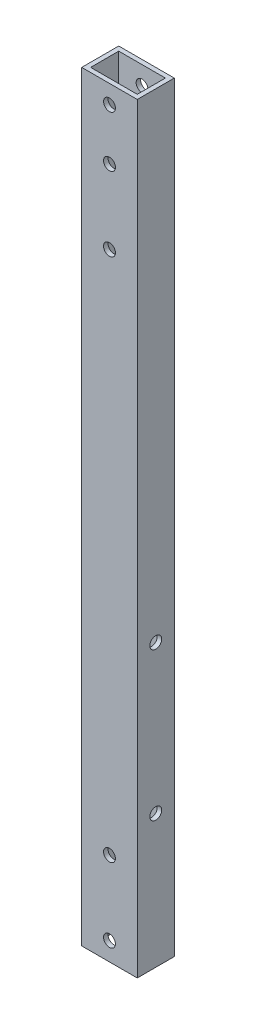
ISO-10303-21;
HEADER;
FILE_DESCRIPTION(('STEP AP214'),'2;1');
FILE_NAME('part.step','',(''),(''),'','','');
FILE_SCHEMA(('AUTOMOTIVE_DESIGN { 1 0 10303 214 1 1 1 1 }'));
ENDSEC;
DATA;
#1=APPLICATION_CONTEXT('core data for automotive mechanical design processes');
#2=APPLICATION_PROTOCOL_DEFINITION('international standard','automotive_design',2000,#1);
#3=PRODUCT_CONTEXT('',#1,'mechanical');
#4=PRODUCT('Part','Part','',(#3));
#5=PRODUCT_RELATED_PRODUCT_CATEGORY('part','',(#4));
#6=PRODUCT_DEFINITION_FORMATION('','',#4);
#7=PRODUCT_DEFINITION_CONTEXT('part definition',#1,'design');
#8=PRODUCT_DEFINITION('design','',#6,#7);
#9=PRODUCT_DEFINITION_SHAPE('','',#8);
#10=(LENGTH_UNIT() NAMED_UNIT(*) SI_UNIT(.MILLI.,.METRE.));
#11=(NAMED_UNIT(*) PLANE_ANGLE_UNIT() SI_UNIT($,.RADIAN.));
#12=(NAMED_UNIT(*) SI_UNIT($,.STERADIAN.) SOLID_ANGLE_UNIT());
#13=UNCERTAINTY_MEASURE_WITH_UNIT(LENGTH_MEASURE(1.E-05),#10,'distance_accuracy_value','');
#14=(GEOMETRIC_REPRESENTATION_CONTEXT(3) GLOBAL_UNCERTAINTY_ASSIGNED_CONTEXT((#13)) GLOBAL_UNIT_ASSIGNED_CONTEXT((#10,
#11,#12)) REPRESENTATION_CONTEXT('',''));
#15=CARTESIAN_POINT('',(0.,0.,0.));
#16=DIRECTION('',(0.,0.,1.));
#17=DIRECTION('',(1.,0.,0.));
#18=AXIS2_PLACEMENT_3D('',#15,#16,#17);
#19=CARTESIAN_POINT('',(7.5,110.,-5.));
#20=DIRECTION('',(-1.,0.,0.));
#21=DIRECTION('',(0.,0.,1.));
#22=AXIS2_PLACEMENT_3D('',#19,#20,#21);
#23=PLANE('',#22);
#24=CARTESIAN_POINT('',(7.5,-74.,0.));
#25=DIRECTION('',(1.,0.,0.));
#26=DIRECTION('',(0.,0.,-1.));
#27=AXIS2_PLACEMENT_3D('',#24,#25,#26);
#28=CIRCLE('',#27,1.60000000000001);
#29=CARTESIAN_POINT('',(7.5,-74.,-1.60000000000001));
#30=VERTEX_POINT('',#29);
#31=EDGE_CURVE('E188',#30,#30,#28,.T.);
#32=ORIENTED_EDGE('',*,*,#31,.F.);
#33=EDGE_LOOP('',(#32));
#34=FACE_BOUND('',#33,.T.);
#35=CARTESIAN_POINT('',(7.5,-34.,0.));
#36=DIRECTION('',(1.,0.,0.));
#37=DIRECTION('',(0.,0.,-1.));
#38=AXIS2_PLACEMENT_3D('',#35,#36,#37);
#39=CIRCLE('',#38,1.6);
#40=CARTESIAN_POINT('',(7.5,-34.,-1.6));
#41=VERTEX_POINT('',#40);
#42=EDGE_CURVE('E191',#41,#41,#39,.T.);
#43=ORIENTED_EDGE('',*,*,#42,.F.);
#44=EDGE_LOOP('',(#43));
#45=FACE_BOUND('',#44,.T.);
#46=DIRECTION('',(0.,0.,-1.));
#47=VECTOR('',#46,1.);
#48=CARTESIAN_POINT('',(7.5,95.5,5.));
#49=LINE('',#48,#47);
#50=CARTESIAN_POINT('',(7.5,95.5,5.));
#51=VERTEX_POINT('',#50);
#52=CARTESIAN_POINT('',(7.5,95.5,-5.));
#53=VERTEX_POINT('',#52);
#54=EDGE_CURVE('E104',#51,#53,#49,.T.);
#55=ORIENTED_EDGE('',*,*,#54,.F.);
#56=DIRECTION('',(0.,-1.,0.));
#57=VECTOR('',#56,1.);
#58=CARTESIAN_POINT('',(7.5,110.,5.));
#59=LINE('',#58,#57);
#60=CARTESIAN_POINT('',(7.5,-110.,5.));
#61=VERTEX_POINT('',#60);
#62=EDGE_CURVE('E114',#51,#61,#59,.T.);
#63=ORIENTED_EDGE('',*,*,#62,.T.);
#64=DIRECTION('',(0.,0.,-1.));
#65=VECTOR('',#64,1.);
#66=CARTESIAN_POINT('',(7.5,-110.,-5.));
#67=LINE('',#66,#65);
#68=CARTESIAN_POINT('',(7.5,-110.,-5.));
#69=VERTEX_POINT('',#68);
#70=EDGE_CURVE('E237',#61,#69,#67,.T.);
#71=ORIENTED_EDGE('',*,*,#70,.T.);
#72=DIRECTION('',(0.,-1.,0.));
#73=VECTOR('',#72,1.);
#74=CARTESIAN_POINT('',(7.5,110.,-5.));
#75=LINE('',#74,#73);
#76=EDGE_CURVE('E47',#53,#69,#75,.T.);
#77=ORIENTED_EDGE('',*,*,#76,.F.);
#78=EDGE_LOOP('',(#55,#63,#71,#77));
#79=FACE_BOUND('',#78,.T.);
#80=ADVANCED_FACE('F39',(#34,#45,#79),#23,.F.);
#81=CARTESIAN_POINT('',(-7.5,110.,-5.));
#82=DIRECTION('',(0.,0.,1.));
#83=DIRECTION('',(1.,0.,0.));
#84=AXIS2_PLACEMENT_3D('',#81,#82,#83);
#85=PLANE('',#84);
#86=CARTESIAN_POINT('',(0.,90.5,-5.));
#87=DIRECTION('',(0.,0.,-1.));
#88=DIRECTION('',(-1.,0.,0.));
#89=AXIS2_PLACEMENT_3D('',#86,#87,#88);
#90=CIRCLE('',#89,1.6);
#91=CARTESIAN_POINT('',(-1.6,90.5,-5.));
#92=VERTEX_POINT('',#91);
#93=EDGE_CURVE('E154',#92,#92,#90,.T.);
#94=ORIENTED_EDGE('',*,*,#93,.F.);
#95=EDGE_LOOP('',(#94));
#96=FACE_BOUND('',#95,.T.);
#97=CARTESIAN_POINT('',(0.,76.66,-5.));
#98=DIRECTION('',(0.,0.,-1.));
#99=DIRECTION('',(-1.,0.,0.));
#100=AXIS2_PLACEMENT_3D('',#97,#98,#99);
#101=CIRCLE('',#100,1.6);
#102=CARTESIAN_POINT('',(-1.6,76.66,-5.));
#103=VERTEX_POINT('',#102);
#104=EDGE_CURVE('E495',#103,#103,#101,.T.);
#105=ORIENTED_EDGE('',*,*,#104,.F.);
#106=EDGE_LOOP('',(#105));
#107=FACE_BOUND('',#106,.T.);
#108=CARTESIAN_POINT('',(0.,56.66,-5.));
#109=DIRECTION('',(0.,0.,-1.));
#110=DIRECTION('',(-1.,0.,0.));
#111=AXIS2_PLACEMENT_3D('',#108,#109,#110);
#112=CIRCLE('',#111,1.6);
#113=CARTESIAN_POINT('',(-1.6,56.66,-5.));
#114=VERTEX_POINT('',#113);
#115=EDGE_CURVE('E498',#114,#114,#112,.T.);
#116=ORIENTED_EDGE('',*,*,#115,.F.);
#117=EDGE_LOOP('',(#116));
#118=FACE_BOUND('',#117,.T.);
#119=CARTESIAN_POINT('',(0.,-105.,-5.));
#120=DIRECTION('',(0.,0.,-1.));
#121=DIRECTION('',(-1.,0.,0.));
#122=AXIS2_PLACEMENT_3D('',#119,#120,#121);
#123=CIRCLE('',#122,1.60000000000001);
#124=CARTESIAN_POINT('',(-1.60000000000001,-105.,-5.));
#125=VERTEX_POINT('',#124);
#126=EDGE_CURVE('E203',#125,#125,#123,.T.);
#127=ORIENTED_EDGE('',*,*,#126,.F.);
#128=EDGE_LOOP('',(#127));
#129=FACE_BOUND('',#128,.T.);
#130=CARTESIAN_POINT('',(0.,-85.,-5.));
#131=DIRECTION('',(0.,0.,-1.));
#132=DIRECTION('',(-1.,0.,0.));
#133=AXIS2_PLACEMENT_3D('',#130,#131,#132);
#134=CIRCLE('',#133,1.6);
#135=CARTESIAN_POINT('',(-1.6,-85.,-5.));
#136=VERTEX_POINT('',#135);
#137=EDGE_CURVE('E136',#136,#136,#134,.T.);
#138=ORIENTED_EDGE('',*,*,#137,.F.);
#139=EDGE_LOOP('',(#138));
#140=FACE_BOUND('',#139,.T.);
#141=DIRECTION('',(-1.,0.,0.));
#142=VECTOR('',#141,1.);
#143=CARTESIAN_POINT('',(7.5,95.5,-5.));
#144=LINE('',#143,#142);
#145=CARTESIAN_POINT('',(-7.5,95.5,-5.));
#146=VERTEX_POINT('',#145);
#147=EDGE_CURVE('E116',#53,#146,#144,.T.);
#148=ORIENTED_EDGE('',*,*,#147,.F.);
#149=ORIENTED_EDGE('',*,*,#76,.T.);
#150=DIRECTION('',(-1.,0.,0.));
#151=VECTOR('',#150,1.);
#152=CARTESIAN_POINT('',(-7.5,-110.,-5.));
#153=LINE('',#152,#151);
#154=CARTESIAN_POINT('',(-7.5,-110.,-5.));
#155=VERTEX_POINT('',#154);
#156=EDGE_CURVE('E239',#69,#155,#153,.T.);
#157=ORIENTED_EDGE('',*,*,#156,.T.);
#158=DIRECTION('',(0.,-1.,0.));
#159=VECTOR('',#158,1.);
#160=CARTESIAN_POINT('',(-7.5,110.,-5.));
#161=LINE('',#160,#159);
#162=EDGE_CURVE('E124',#146,#155,#161,.T.);
#163=ORIENTED_EDGE('',*,*,#162,.F.);
#164=EDGE_LOOP('',(#148,#149,#157,#163));
#165=FACE_BOUND('',#164,.T.);
#166=ADVANCED_FACE('F251',(#96,#107,#118,#129,#140,#165),#85,.F.);
#167=CARTESIAN_POINT('',(-7.5,110.,-5.));
#168=DIRECTION('',(1.,0.,0.));
#169=DIRECTION('',(0.,0.,-1.));
#170=AXIS2_PLACEMENT_3D('',#167,#168,#169);
#171=PLANE('',#170);
#172=CARTESIAN_POINT('',(-7.5,-74.,0.));
#173=DIRECTION('',(1.,0.,0.));
#174=DIRECTION('',(0.,0.,-1.));
#175=AXIS2_PLACEMENT_3D('',#172,#173,#174);
#176=CIRCLE('',#175,1.60000000000001);
#177=CARTESIAN_POINT('',(-7.5,-74.,-1.60000000000001));
#178=VERTEX_POINT('',#177);
#179=EDGE_CURVE('E194',#178,#178,#176,.T.);
#180=ORIENTED_EDGE('',*,*,#179,.T.);
#181=EDGE_LOOP('',(#180));
#182=FACE_BOUND('',#181,.T.);
#183=CARTESIAN_POINT('',(-7.5,-34.,0.));
#184=DIRECTION('',(1.,0.,0.));
#185=DIRECTION('',(0.,0.,-1.));
#186=AXIS2_PLACEMENT_3D('',#183,#184,#185);
#187=CIRCLE('',#186,1.6);
#188=CARTESIAN_POINT('',(-7.5,-34.,-1.6));
#189=VERTEX_POINT('',#188);
#190=EDGE_CURVE('E146',#189,#189,#187,.T.);
#191=ORIENTED_EDGE('',*,*,#190,.T.);
#192=EDGE_LOOP('',(#191));
#193=FACE_BOUND('',#192,.T.);
#194=DIRECTION('',(0.,0.,1.));
#195=VECTOR('',#194,1.);
#196=CARTESIAN_POINT('',(-7.5,95.5,-5.));
#197=LINE('',#196,#195);
#198=CARTESIAN_POINT('',(-7.5,95.5,5.));
#199=VERTEX_POINT('',#198);
#200=EDGE_CURVE('E55',#146,#199,#197,.T.);
#201=ORIENTED_EDGE('',*,*,#200,.F.);
#202=ORIENTED_EDGE('',*,*,#162,.T.);
#203=DIRECTION('',(0.,0.,1.));
#204=VECTOR('',#203,1.);
#205=CARTESIAN_POINT('',(-7.5,-110.,-5.));
#206=LINE('',#205,#204);
#207=CARTESIAN_POINT('',(-7.5,-110.,5.));
#208=VERTEX_POINT('',#207);
#209=EDGE_CURVE('E126',#155,#208,#206,.T.);
#210=ORIENTED_EDGE('',*,*,#209,.T.);
#211=DIRECTION('',(0.,-1.,0.));
#212=VECTOR('',#211,1.);
#213=CARTESIAN_POINT('',(-7.5,110.,5.));
#214=LINE('',#213,#212);
#215=EDGE_CURVE('E122',#199,#208,#214,.T.);
#216=ORIENTED_EDGE('',*,*,#215,.F.);
#217=EDGE_LOOP('',(#201,#202,#210,#216));
#218=FACE_BOUND('',#217,.T.);
#219=ADVANCED_FACE('F244',(#182,#193,#218),#171,.F.);
#220=CARTESIAN_POINT('',(-7.5,110.,5.));
#221=DIRECTION('',(0.,0.,-1.));
#222=DIRECTION('',(-1.,0.,0.));
#223=AXIS2_PLACEMENT_3D('',#220,#221,#222);
#224=PLANE('',#223);
#225=CARTESIAN_POINT('',(0.,90.5,5.));
#226=DIRECTION('',(0.,0.,-1.));
#227=DIRECTION('',(-1.,0.,0.));
#228=AXIS2_PLACEMENT_3D('',#225,#226,#227);
#229=CIRCLE('',#228,1.6);
#230=CARTESIAN_POINT('',(-1.6,90.5,5.));
#231=VERTEX_POINT('',#230);
#232=EDGE_CURVE('E109',#231,#231,#229,.T.);
#233=ORIENTED_EDGE('',*,*,#232,.T.);
#234=EDGE_LOOP('',(#233));
#235=FACE_BOUND('',#234,.T.);
#236=CARTESIAN_POINT('',(0.,76.66,5.));
#237=DIRECTION('',(0.,0.,-1.));
#238=DIRECTION('',(-1.,0.,0.));
#239=AXIS2_PLACEMENT_3D('',#236,#237,#238);
#240=CIRCLE('',#239,1.6);
#241=CARTESIAN_POINT('',(-1.6,76.66,5.));
#242=VERTEX_POINT('',#241);
#243=EDGE_CURVE('E162',#242,#242,#240,.T.);
#244=ORIENTED_EDGE('',*,*,#243,.T.);
#245=EDGE_LOOP('',(#244));
#246=FACE_BOUND('',#245,.T.);
#247=CARTESIAN_POINT('',(0.,56.66,5.));
#248=DIRECTION('',(0.,0.,-1.));
#249=DIRECTION('',(-1.,0.,0.));
#250=AXIS2_PLACEMENT_3D('',#247,#248,#249);
#251=CIRCLE('',#250,1.6);
#252=CARTESIAN_POINT('',(-1.6,56.66,5.));
#253=VERTEX_POINT('',#252);
#254=EDGE_CURVE('E158',#253,#253,#251,.T.);
#255=ORIENTED_EDGE('',*,*,#254,.T.);
#256=EDGE_LOOP('',(#255));
#257=FACE_BOUND('',#256,.T.);
#258=CARTESIAN_POINT('',(0.,-105.,5.));
#259=DIRECTION('',(0.,0.,-1.));
#260=DIRECTION('',(-1.,0.,0.));
#261=AXIS2_PLACEMENT_3D('',#258,#259,#260);
#262=CIRCLE('',#261,1.60000000000001);
#263=CARTESIAN_POINT('',(-1.60000000000001,-105.,5.));
#264=VERTEX_POINT('',#263);
#265=EDGE_CURVE('E141',#264,#264,#262,.T.);
#266=ORIENTED_EDGE('',*,*,#265,.T.);
#267=EDGE_LOOP('',(#266));
#268=FACE_BOUND('',#267,.T.);
#269=CARTESIAN_POINT('',(0.,-85.,5.));
#270=DIRECTION('',(0.,0.,-1.));
#271=DIRECTION('',(-1.,0.,0.));
#272=AXIS2_PLACEMENT_3D('',#269,#270,#271);
#273=CIRCLE('',#272,1.6);
#274=CARTESIAN_POINT('',(-1.6,-85.,5.));
#275=VERTEX_POINT('',#274);
#276=EDGE_CURVE('E214',#275,#275,#273,.T.);
#277=ORIENTED_EDGE('',*,*,#276,.T.);
#278=EDGE_LOOP('',(#277));
#279=FACE_BOUND('',#278,.T.);
#280=DIRECTION('',(1.,0.,0.));
#281=VECTOR('',#280,1.);
#282=CARTESIAN_POINT('',(-7.5,95.5,5.));
#283=LINE('',#282,#281);
#284=EDGE_CURVE('E101',#199,#51,#283,.T.);
#285=ORIENTED_EDGE('',*,*,#284,.F.);
#286=ORIENTED_EDGE('',*,*,#215,.T.);
#287=DIRECTION('',(1.,0.,0.));
#288=VECTOR('',#287,1.);
#289=CARTESIAN_POINT('',(-7.5,-110.,5.));
#290=LINE('',#289,#288);
#291=EDGE_CURVE('E120',#208,#61,#290,.T.);
#292=ORIENTED_EDGE('',*,*,#291,.T.);
#293=ORIENTED_EDGE('',*,*,#62,.F.);
#294=EDGE_LOOP('',(#285,#286,#292,#293));
#295=FACE_BOUND('',#294,.T.);
#296=ADVANCED_FACE('F118',(#235,#246,#257,#268,#279,#295),#224,.F.);
#297=CARTESIAN_POINT('',(-6.3,110.,-3.8));
#298=DIRECTION('',(1.,0.,0.));
#299=DIRECTION('',(0.,0.,-1.));
#300=AXIS2_PLACEMENT_3D('',#297,#298,#299);
#301=PLANE('',#300);
#302=CARTESIAN_POINT('',(-6.3,-34.,0.));
#303=DIRECTION('',(1.,0.,0.));
#304=DIRECTION('',(0.,0.,-1.));
#305=AXIS2_PLACEMENT_3D('',#302,#303,#304);
#306=CIRCLE('',#305,1.6);
#307=CARTESIAN_POINT('',(-6.3,-34.,-1.6));
#308=VERTEX_POINT('',#307);
#309=EDGE_CURVE('E149',#308,#308,#306,.T.);
#310=ORIENTED_EDGE('',*,*,#309,.F.);
#311=EDGE_LOOP('',(#310));
#312=FACE_BOUND('',#311,.T.);
#313=CARTESIAN_POINT('',(-6.3,-74.,0.));
#314=DIRECTION('',(1.,0.,0.));
#315=DIRECTION('',(0.,0.,-1.));
#316=AXIS2_PLACEMENT_3D('',#313,#314,#315);
#317=CIRCLE('',#316,1.60000000000001);
#318=CARTESIAN_POINT('',(-6.3,-74.,-1.60000000000001));
#319=VERTEX_POINT('',#318);
#320=EDGE_CURVE('E145',#319,#319,#317,.T.);
#321=ORIENTED_EDGE('',*,*,#320,.F.);
#322=EDGE_LOOP('',(#321));
#323=FACE_BOUND('',#322,.T.);
#324=DIRECTION('',(0.,-1.,0.));
#325=VECTOR('',#324,1.);
#326=CARTESIAN_POINT('',(-6.3,110.,-3.8));
#327=LINE('',#326,#325);
#328=CARTESIAN_POINT('',(-6.3,95.5,-3.8));
#329=VERTEX_POINT('',#328);
#330=CARTESIAN_POINT('',(-6.3,-110.,-3.8));
#331=VERTEX_POINT('',#330);
#332=EDGE_CURVE('E229',#329,#331,#327,.T.);
#333=ORIENTED_EDGE('',*,*,#332,.F.);
#334=DIRECTION('',(0.,0.,1.));
#335=VECTOR('',#334,1.);
#336=CARTESIAN_POINT('',(-6.3,95.5,-3.8));
#337=LINE('',#336,#335);
#338=CARTESIAN_POINT('',(-6.3,95.5,3.8));
#339=VERTEX_POINT('',#338);
#340=EDGE_CURVE('E63',#329,#339,#337,.T.);
#341=ORIENTED_EDGE('',*,*,#340,.T.);
#342=DIRECTION('',(0.,-1.,0.));
#343=VECTOR('',#342,1.);
#344=CARTESIAN_POINT('',(-6.3,110.,3.8));
#345=LINE('',#344,#343);
#346=CARTESIAN_POINT('',(-6.3,-110.,3.8));
#347=VERTEX_POINT('',#346);
#348=EDGE_CURVE('E235',#339,#347,#345,.T.);
#349=ORIENTED_EDGE('',*,*,#348,.T.);
#350=DIRECTION('',(0.,0.,1.));
#351=VECTOR('',#350,1.);
#352=CARTESIAN_POINT('',(-6.3,-110.,-3.8));
#353=LINE('',#352,#351);
#354=EDGE_CURVE('E217',#331,#347,#353,.T.);
#355=ORIENTED_EDGE('',*,*,#354,.F.);
#356=EDGE_LOOP('',(#333,#341,#349,#355));
#357=FACE_BOUND('',#356,.T.);
#358=ADVANCED_FACE('F267',(#312,#323,#357),#301,.T.);
#359=CARTESIAN_POINT('',(-6.3,110.,3.8));
#360=DIRECTION('',(0.,0.,-1.));
#361=DIRECTION('',(-1.,0.,0.));
#362=AXIS2_PLACEMENT_3D('',#359,#360,#361);
#363=PLANE('',#362);
#364=CARTESIAN_POINT('',(0.,90.5,3.8));
#365=DIRECTION('',(0.,0.,-1.));
#366=DIRECTION('',(-1.,0.,0.));
#367=AXIS2_PLACEMENT_3D('',#364,#365,#366);
#368=CIRCLE('',#367,1.6);
#369=CARTESIAN_POINT('',(-1.6,90.5,3.8));
#370=VERTEX_POINT('',#369);
#371=EDGE_CURVE('E174',#370,#370,#368,.T.);
#372=ORIENTED_EDGE('',*,*,#371,.F.);
#373=EDGE_LOOP('',(#372));
#374=FACE_BOUND('',#373,.T.);
#375=CARTESIAN_POINT('',(0.,76.66,3.8));
#376=DIRECTION('',(0.,0.,-1.));
#377=DIRECTION('',(-1.,0.,0.));
#378=AXIS2_PLACEMENT_3D('',#375,#376,#377);
#379=CIRCLE('',#378,1.6);
#380=CARTESIAN_POINT('',(-1.6,76.66,3.8));
#381=VERTEX_POINT('',#380);
#382=EDGE_CURVE('E157',#381,#381,#379,.T.);
#383=ORIENTED_EDGE('',*,*,#382,.F.);
#384=EDGE_LOOP('',(#383));
#385=FACE_BOUND('',#384,.T.);
#386=CARTESIAN_POINT('',(0.,56.66,3.8));
#387=DIRECTION('',(0.,0.,-1.));
#388=DIRECTION('',(-1.,0.,0.));
#389=AXIS2_PLACEMENT_3D('',#386,#387,#388);
#390=CIRCLE('',#389,1.6);
#391=CARTESIAN_POINT('',(-1.6,56.66,3.8));
#392=VERTEX_POINT('',#391);
#393=EDGE_CURVE('E153',#392,#392,#390,.T.);
#394=ORIENTED_EDGE('',*,*,#393,.F.);
#395=EDGE_LOOP('',(#394));
#396=FACE_BOUND('',#395,.T.);
#397=CARTESIAN_POINT('',(0.,-85.,3.8));
#398=DIRECTION('',(0.,0.,-1.));
#399=DIRECTION('',(-1.,0.,0.));
#400=AXIS2_PLACEMENT_3D('',#397,#398,#399);
#401=CIRCLE('',#400,1.6);
#402=CARTESIAN_POINT('',(-1.6,-85.,3.8));
#403=VERTEX_POINT('',#402);
#404=EDGE_CURVE('E140',#403,#403,#401,.T.);
#405=ORIENTED_EDGE('',*,*,#404,.F.);
#406=EDGE_LOOP('',(#405));
#407=FACE_BOUND('',#406,.T.);
#408=CARTESIAN_POINT('',(0.,-105.,3.8));
#409=DIRECTION('',(0.,0.,-1.));
#410=DIRECTION('',(-1.,0.,0.));
#411=AXIS2_PLACEMENT_3D('',#408,#409,#410);
#412=CIRCLE('',#411,1.60000000000001);
#413=CARTESIAN_POINT('',(-1.60000000000001,-105.,3.8));
#414=VERTEX_POINT('',#413);
#415=EDGE_CURVE('E135',#414,#414,#412,.T.);
#416=ORIENTED_EDGE('',*,*,#415,.F.);
#417=EDGE_LOOP('',(#416));
#418=FACE_BOUND('',#417,.T.);
#419=ORIENTED_EDGE('',*,*,#348,.F.);
#420=DIRECTION('',(1.,0.,0.));
#421=VECTOR('',#420,1.);
#422=CARTESIAN_POINT('',(-6.3,95.5,3.8));
#423=LINE('',#422,#421);
#424=CARTESIAN_POINT('',(6.3,95.5,3.8));
#425=VERTEX_POINT('',#424);
#426=EDGE_CURVE('E184',#339,#425,#423,.T.);
#427=ORIENTED_EDGE('',*,*,#426,.T.);
#428=DIRECTION('',(0.,-1.,0.));
#429=VECTOR('',#428,1.);
#430=CARTESIAN_POINT('',(6.3,110.,3.8));
#431=LINE('',#430,#429);
#432=CARTESIAN_POINT('',(6.3,-110.,3.8));
#433=VERTEX_POINT('',#432);
#434=EDGE_CURVE('E233',#425,#433,#431,.T.);
#435=ORIENTED_EDGE('',*,*,#434,.T.);
#436=DIRECTION('',(1.,0.,0.));
#437=VECTOR('',#436,1.);
#438=CARTESIAN_POINT('',(-6.3,-110.,3.8));
#439=LINE('',#438,#437);
#440=EDGE_CURVE('E220',#347,#433,#439,.T.);
#441=ORIENTED_EDGE('',*,*,#440,.F.);
#442=EDGE_LOOP('',(#419,#427,#435,#441));
#443=FACE_BOUND('',#442,.T.);
#444=ADVANCED_FACE('F275',(#374,#385,#396,#407,#418,#443),#363,.T.);
#445=CARTESIAN_POINT('',(6.3,110.,-3.8));
#446=DIRECTION('',(-1.,0.,0.));
#447=DIRECTION('',(0.,0.,1.));
#448=AXIS2_PLACEMENT_3D('',#445,#446,#447);
#449=PLANE('',#448);
#450=CARTESIAN_POINT('',(6.3,-34.,0.));
#451=DIRECTION('',(-1.,0.,0.));
#452=DIRECTION('',(0.,0.,1.));
#453=AXIS2_PLACEMENT_3D('',#450,#451,#452);
#454=CIRCLE('',#453,1.6);
#455=CARTESIAN_POINT('',(6.3,-34.,1.6));
#456=VERTEX_POINT('',#455);
#457=EDGE_CURVE('E147',#456,#456,#454,.T.);
#458=ORIENTED_EDGE('',*,*,#457,.F.);
#459=EDGE_LOOP('',(#458));
#460=FACE_BOUND('',#459,.T.);
#461=CARTESIAN_POINT('',(6.3,-74.,0.));
#462=DIRECTION('',(-1.,0.,0.));
#463=DIRECTION('',(0.,0.,1.));
#464=AXIS2_PLACEMENT_3D('',#461,#462,#463);
#465=CIRCLE('',#464,1.60000000000001);
#466=CARTESIAN_POINT('',(6.3,-74.,1.60000000000001));
#467=VERTEX_POINT('',#466);
#468=EDGE_CURVE('E142',#467,#467,#465,.T.);
#469=ORIENTED_EDGE('',*,*,#468,.F.);
#470=EDGE_LOOP('',(#469));
#471=FACE_BOUND('',#470,.T.);
#472=ORIENTED_EDGE('',*,*,#434,.F.);
#473=DIRECTION('',(0.,0.,-1.));
#474=VECTOR('',#473,1.);
#475=CARTESIAN_POINT('',(6.3,95.5,-3.8));
#476=LINE('',#475,#474);
#477=CARTESIAN_POINT('',(6.3,95.5,-3.8));
#478=VERTEX_POINT('',#477);
#479=EDGE_CURVE('E181',#425,#478,#476,.T.);
#480=ORIENTED_EDGE('',*,*,#479,.T.);
#481=DIRECTION('',(0.,-1.,0.));
#482=VECTOR('',#481,1.);
#483=CARTESIAN_POINT('',(6.3,110.,-3.8));
#484=LINE('',#483,#482);
#485=CARTESIAN_POINT('',(6.3,-110.,-3.8));
#486=VERTEX_POINT('',#485);
#487=EDGE_CURVE('E231',#478,#486,#484,.T.);
#488=ORIENTED_EDGE('',*,*,#487,.T.);
#489=DIRECTION('',(0.,0.,-1.));
#490=VECTOR('',#489,1.);
#491=CARTESIAN_POINT('',(6.3,-110.,-3.8));
#492=LINE('',#491,#490);
#493=EDGE_CURVE('E223',#433,#486,#492,.T.);
#494=ORIENTED_EDGE('',*,*,#493,.F.);
#495=EDGE_LOOP('',(#472,#480,#488,#494));
#496=FACE_BOUND('',#495,.T.);
#497=ADVANCED_FACE('F279',(#460,#471,#496),#449,.T.);
#498=CARTESIAN_POINT('',(-6.3,110.,-3.8));
#499=DIRECTION('',(0.,0.,1.));
#500=DIRECTION('',(1.,0.,0.));
#501=AXIS2_PLACEMENT_3D('',#498,#499,#500);
#502=PLANE('',#501);
#503=CARTESIAN_POINT('',(0.,90.5,-3.8));
#504=DIRECTION('',(0.,0.,1.));
#505=DIRECTION('',(1.,0.,0.));
#506=AXIS2_PLACEMENT_3D('',#503,#504,#505);
#507=CIRCLE('',#506,1.6);
#508=CARTESIAN_POINT('',(1.6,90.5,-3.8));
#509=VERTEX_POINT('',#508);
#510=EDGE_CURVE('E42',#509,#509,#507,.T.);
#511=ORIENTED_EDGE('',*,*,#510,.F.);
#512=EDGE_LOOP('',(#511));
#513=FACE_BOUND('',#512,.T.);
#514=CARTESIAN_POINT('',(0.,76.66,-3.8));
#515=DIRECTION('',(0.,0.,1.));
#516=DIRECTION('',(1.,0.,0.));
#517=AXIS2_PLACEMENT_3D('',#514,#515,#516);
#518=CIRCLE('',#517,1.6);
#519=CARTESIAN_POINT('',(1.6,76.66,-3.8));
#520=VERTEX_POINT('',#519);
#521=EDGE_CURVE('E155',#520,#520,#518,.T.);
#522=ORIENTED_EDGE('',*,*,#521,.F.);
#523=EDGE_LOOP('',(#522));
#524=FACE_BOUND('',#523,.T.);
#525=CARTESIAN_POINT('',(0.,56.66,-3.8));
#526=DIRECTION('',(0.,0.,1.));
#527=DIRECTION('',(1.,0.,0.));
#528=AXIS2_PLACEMENT_3D('',#525,#526,#527);
#529=CIRCLE('',#528,1.6);
#530=CARTESIAN_POINT('',(1.6,56.66,-3.8));
#531=VERTEX_POINT('',#530);
#532=EDGE_CURVE('E151',#531,#531,#529,.T.);
#533=ORIENTED_EDGE('',*,*,#532,.F.);
#534=EDGE_LOOP('',(#533));
#535=FACE_BOUND('',#534,.T.);
#536=CARTESIAN_POINT('',(0.,-85.,-3.8));
#537=DIRECTION('',(0.,0.,1.));
#538=DIRECTION('',(1.,0.,0.));
#539=AXIS2_PLACEMENT_3D('',#536,#537,#538);
#540=CIRCLE('',#539,1.6);
#541=CARTESIAN_POINT('',(1.6,-85.,-3.8));
#542=VERTEX_POINT('',#541);
#543=EDGE_CURVE('E137',#542,#542,#540,.T.);
#544=ORIENTED_EDGE('',*,*,#543,.F.);
#545=EDGE_LOOP('',(#544));
#546=FACE_BOUND('',#545,.T.);
#547=CARTESIAN_POINT('',(0.,-105.,-3.8));
#548=DIRECTION('',(0.,0.,1.));
#549=DIRECTION('',(1.,0.,0.));
#550=AXIS2_PLACEMENT_3D('',#547,#548,#549);
#551=CIRCLE('',#550,1.60000000000001);
#552=CARTESIAN_POINT('',(1.60000000000001,-105.,-3.8));
#553=VERTEX_POINT('',#552);
#554=EDGE_CURVE('E132',#553,#553,#551,.T.);
#555=ORIENTED_EDGE('',*,*,#554,.F.);
#556=EDGE_LOOP('',(#555));
#557=FACE_BOUND('',#556,.T.);
#558=ORIENTED_EDGE('',*,*,#487,.F.);
#559=DIRECTION('',(-1.,0.,0.));
#560=VECTOR('',#559,1.);
#561=CARTESIAN_POINT('',(-6.3,95.5,-3.8));
#562=LINE('',#561,#560);
#563=EDGE_CURVE('E11',#478,#329,#562,.T.);
#564=ORIENTED_EDGE('',*,*,#563,.T.);
#565=ORIENTED_EDGE('',*,*,#332,.T.);
#566=DIRECTION('',(-1.,0.,0.));
#567=VECTOR('',#566,1.);
#568=CARTESIAN_POINT('',(-6.3,-110.,-3.8));
#569=LINE('',#568,#567);
#570=EDGE_CURVE('E226',#486,#331,#569,.T.);
#571=ORIENTED_EDGE('',*,*,#570,.F.);
#572=EDGE_LOOP('',(#558,#564,#565,#571));
#573=FACE_BOUND('',#572,.T.);
#574=ADVANCED_FACE('F272',(#513,#524,#535,#546,#557,#573),#502,.T.);
#575=CARTESIAN_POINT('',(0.,-110.,0.));
#576=DIRECTION('',(0.,1.,0.));
#577=DIRECTION('',(0.,0.,1.));
#578=AXIS2_PLACEMENT_3D('',#575,#576,#577);
#579=PLANE('',#578);
#580=ORIENTED_EDGE('',*,*,#70,.F.);
#581=ORIENTED_EDGE('',*,*,#291,.F.);
#582=ORIENTED_EDGE('',*,*,#209,.F.);
#583=ORIENTED_EDGE('',*,*,#156,.F.);
#584=EDGE_LOOP('',(#580,#581,#582,#583));
#585=FACE_BOUND('',#584,.T.);
#586=ORIENTED_EDGE('',*,*,#354,.T.);
#587=ORIENTED_EDGE('',*,*,#440,.T.);
#588=ORIENTED_EDGE('',*,*,#493,.T.);
#589=ORIENTED_EDGE('',*,*,#570,.T.);
#590=EDGE_LOOP('',(#586,#587,#588,#589));
#591=FACE_BOUND('',#590,.T.);
#592=ADVANCED_FACE('F248',(#585,#591),#579,.F.);
#593=CARTESIAN_POINT('',(0.,-105.,95.));
#594=DIRECTION('',(0.,0.,-1.));
#595=DIRECTION('',(-1.,0.,0.));
#596=AXIS2_PLACEMENT_3D('',#593,#594,#595);
#597=CYLINDRICAL_SURFACE('',#596,1.60000000000001);
#598=ORIENTED_EDGE('',*,*,#554,.T.);
#599=EDGE_LOOP('',(#598));
#600=FACE_BOUND('',#599,.T.);
#601=ORIENTED_EDGE('',*,*,#126,.T.);
#602=EDGE_LOOP('',(#601));
#603=FACE_BOUND('',#602,.T.);
#604=ADVANCED_FACE('F271',(#600,#603),#597,.F.);
#605=CARTESIAN_POINT('',(0.,-85.,95.));
#606=DIRECTION('',(0.,0.,-1.));
#607=DIRECTION('',(-1.,0.,0.));
#608=AXIS2_PLACEMENT_3D('',#605,#606,#607);
#609=CYLINDRICAL_SURFACE('',#608,1.6);
#610=ORIENTED_EDGE('',*,*,#543,.T.);
#611=EDGE_LOOP('',(#610));
#612=FACE_BOUND('',#611,.T.);
#613=ORIENTED_EDGE('',*,*,#137,.T.);
#614=EDGE_LOOP('',(#613));
#615=FACE_BOUND('',#614,.T.);
#616=ADVANCED_FACE('F289',(#612,#615),#609,.F.);
#617=ORIENTED_EDGE('',*,*,#415,.T.);
#618=EDGE_LOOP('',(#617));
#619=FACE_BOUND('',#618,.T.);
#620=ORIENTED_EDGE('',*,*,#265,.F.);
#621=EDGE_LOOP('',(#620));
#622=FACE_BOUND('',#621,.T.);
#623=ADVANCED_FACE('F291',(#619,#622),#597,.F.);
#624=ORIENTED_EDGE('',*,*,#404,.T.);
#625=EDGE_LOOP('',(#624));
#626=FACE_BOUND('',#625,.T.);
#627=ORIENTED_EDGE('',*,*,#276,.F.);
#628=EDGE_LOOP('',(#627));
#629=FACE_BOUND('',#628,.T.);
#630=ADVANCED_FACE('F295',(#626,#629),#609,.F.);
#631=CARTESIAN_POINT('',(-7.5,-74.,0.));
#632=DIRECTION('',(1.,0.,0.));
#633=DIRECTION('',(0.,0.,-1.));
#634=AXIS2_PLACEMENT_3D('',#631,#632,#633);
#635=CYLINDRICAL_SURFACE('',#634,1.60000000000001);
#636=ORIENTED_EDGE('',*,*,#468,.T.);
#637=EDGE_LOOP('',(#636));
#638=FACE_BOUND('',#637,.T.);
#639=ORIENTED_EDGE('',*,*,#31,.T.);
#640=EDGE_LOOP('',(#639));
#641=FACE_BOUND('',#640,.T.);
#642=ADVANCED_FACE('F296',(#638,#641),#635,.F.);
#643=CARTESIAN_POINT('',(-7.5,-34.,0.));
#644=DIRECTION('',(1.,0.,0.));
#645=DIRECTION('',(0.,0.,-1.));
#646=AXIS2_PLACEMENT_3D('',#643,#644,#645);
#647=CYLINDRICAL_SURFACE('',#646,1.6);
#648=ORIENTED_EDGE('',*,*,#457,.T.);
#649=EDGE_LOOP('',(#648));
#650=FACE_BOUND('',#649,.T.);
#651=ORIENTED_EDGE('',*,*,#42,.T.);
#652=EDGE_LOOP('',(#651));
#653=FACE_BOUND('',#652,.T.);
#654=ADVANCED_FACE('F299',(#650,#653),#647,.F.);
#655=ORIENTED_EDGE('',*,*,#320,.T.);
#656=EDGE_LOOP('',(#655));
#657=FACE_BOUND('',#656,.T.);
#658=ORIENTED_EDGE('',*,*,#179,.F.);
#659=EDGE_LOOP('',(#658));
#660=FACE_BOUND('',#659,.T.);
#661=ADVANCED_FACE('F301',(#657,#660),#635,.F.);
#662=ORIENTED_EDGE('',*,*,#309,.T.);
#663=EDGE_LOOP('',(#662));
#664=FACE_BOUND('',#663,.T.);
#665=ORIENTED_EDGE('',*,*,#190,.F.);
#666=EDGE_LOOP('',(#665));
#667=FACE_BOUND('',#666,.T.);
#668=ADVANCED_FACE('F305',(#664,#667),#647,.F.);
#669=CARTESIAN_POINT('',(0.,95.5,0.));
#670=DIRECTION('',(0.,1.,0.));
#671=DIRECTION('',(0.,0.,1.));
#672=AXIS2_PLACEMENT_3D('',#669,#670,#671);
#673=PLANE('',#672);
#674=ORIENTED_EDGE('',*,*,#563,.F.);
#675=ORIENTED_EDGE('',*,*,#479,.F.);
#676=ORIENTED_EDGE('',*,*,#426,.F.);
#677=ORIENTED_EDGE('',*,*,#340,.F.);
#678=EDGE_LOOP('',(#674,#675,#676,#677));
#679=FACE_BOUND('',#678,.T.);
#680=ORIENTED_EDGE('',*,*,#284,.T.);
#681=ORIENTED_EDGE('',*,*,#54,.T.);
#682=ORIENTED_EDGE('',*,*,#147,.T.);
#683=ORIENTED_EDGE('',*,*,#200,.T.);
#684=EDGE_LOOP('',(#680,#681,#682,#683));
#685=FACE_BOUND('',#684,.T.);
#686=ADVANCED_FACE('F103',(#679,#685),#673,.T.);
#687=CARTESIAN_POINT('',(0.,56.66,10.));
#688=DIRECTION('',(0.,0.,-1.));
#689=DIRECTION('',(-1.,0.,0.));
#690=AXIS2_PLACEMENT_3D('',#687,#688,#689);
#691=CYLINDRICAL_SURFACE('',#690,1.6);
#692=ORIENTED_EDGE('',*,*,#532,.T.);
#693=EDGE_LOOP('',(#692));
#694=FACE_BOUND('',#693,.T.);
#695=ORIENTED_EDGE('',*,*,#115,.T.);
#696=EDGE_LOOP('',(#695));
#697=FACE_BOUND('',#696,.T.);
#698=ADVANCED_FACE('F307',(#694,#697),#691,.F.);
#699=CARTESIAN_POINT('',(0.,76.66,10.));
#700=DIRECTION('',(0.,0.,-1.));
#701=DIRECTION('',(-1.,0.,0.));
#702=AXIS2_PLACEMENT_3D('',#699,#700,#701);
#703=CYLINDRICAL_SURFACE('',#702,1.6);
#704=ORIENTED_EDGE('',*,*,#521,.T.);
#705=EDGE_LOOP('',(#704));
#706=FACE_BOUND('',#705,.T.);
#707=ORIENTED_EDGE('',*,*,#104,.T.);
#708=EDGE_LOOP('',(#707));
#709=FACE_BOUND('',#708,.T.);
#710=ADVANCED_FACE('F310',(#706,#709),#703,.F.);
#711=CARTESIAN_POINT('',(0.,90.5,10.));
#712=DIRECTION('',(0.,0.,-1.));
#713=DIRECTION('',(-1.,0.,0.));
#714=AXIS2_PLACEMENT_3D('',#711,#712,#713);
#715=CYLINDRICAL_SURFACE('',#714,1.6);
#716=ORIENTED_EDGE('',*,*,#510,.T.);
#717=EDGE_LOOP('',(#716));
#718=FACE_BOUND('',#717,.T.);
#719=ORIENTED_EDGE('',*,*,#93,.T.);
#720=EDGE_LOOP('',(#719));
#721=FACE_BOUND('',#720,.T.);
#722=ADVANCED_FACE('F315',(#718,#721),#715,.F.);
#723=ORIENTED_EDGE('',*,*,#393,.T.);
#724=EDGE_LOOP('',(#723));
#725=FACE_BOUND('',#724,.T.);
#726=ORIENTED_EDGE('',*,*,#254,.F.);
#727=EDGE_LOOP('',(#726));
#728=FACE_BOUND('',#727,.T.);
#729=ADVANCED_FACE('F312',(#725,#728),#691,.F.);
#730=ORIENTED_EDGE('',*,*,#382,.T.);
#731=EDGE_LOOP('',(#730));
#732=FACE_BOUND('',#731,.T.);
#733=ORIENTED_EDGE('',*,*,#243,.F.);
#734=EDGE_LOOP('',(#733));
#735=FACE_BOUND('',#734,.T.);
#736=ADVANCED_FACE('F316',(#732,#735),#703,.F.);
#737=ORIENTED_EDGE('',*,*,#371,.T.);
#738=EDGE_LOOP('',(#737));
#739=FACE_BOUND('',#738,.T.);
#740=ORIENTED_EDGE('',*,*,#232,.F.);
#741=EDGE_LOOP('',(#740));
#742=FACE_BOUND('',#741,.T.);
#743=ADVANCED_FACE('F319',(#739,#742),#715,.F.);
#744=CLOSED_SHELL('',(#80,#166,#219,#296,#358,#444,#497,#574,#592,#604,#616,#623,#630,#642,#654,
#661,#668,#686,#698,#710,#722,#729,#736,#743));
#745=MANIFOLD_SOLID_BREP('B2',#744);
#746=ADVANCED_BREP_SHAPE_REPRESENTATION('',(#18,#745),#14);
#747=SHAPE_DEFINITION_REPRESENTATION(#9,#746);
ENDSEC;
END-ISO-10303-21;
